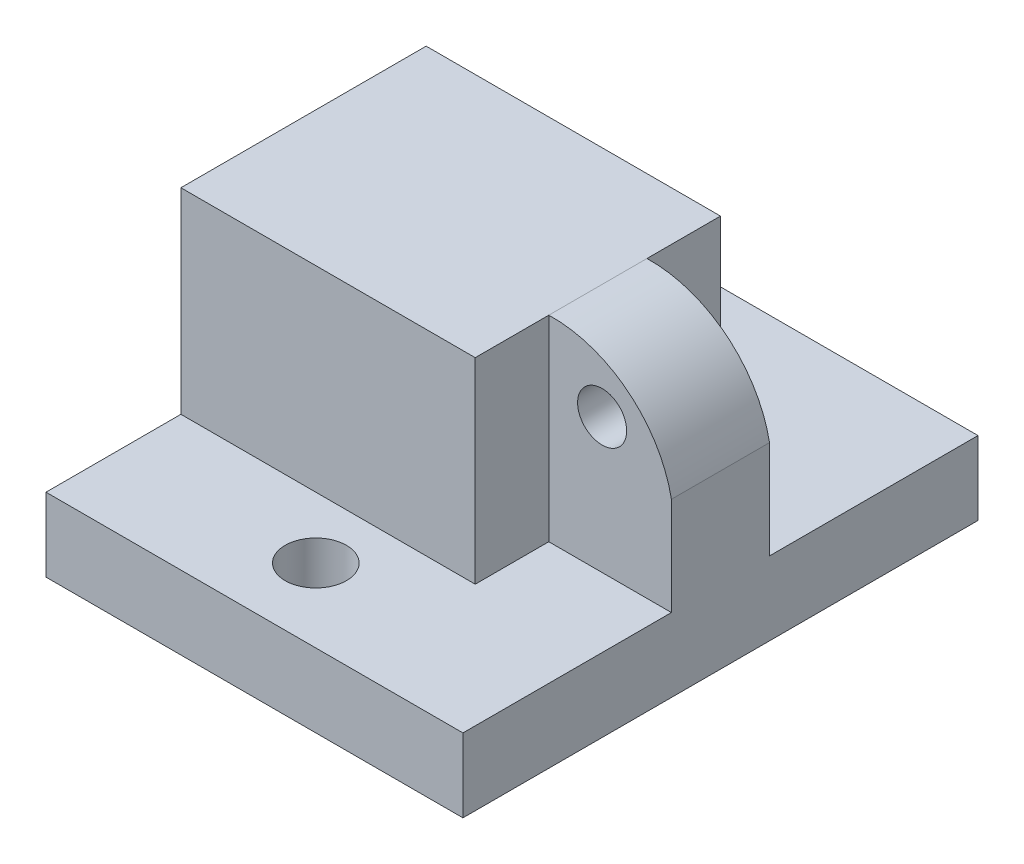
ISO-10303-21;
HEADER;
FILE_DESCRIPTION(('STEP AP214'),'2;1');
FILE_NAME('part.step','',(''),(''),'','','');
FILE_SCHEMA(('AUTOMOTIVE_DESIGN { 1 0 10303 214 1 1 1 1 }'));
ENDSEC;
DATA;
#1=APPLICATION_CONTEXT('core data for automotive mechanical design processes');
#2=APPLICATION_PROTOCOL_DEFINITION('international standard','automotive_design',2000,#1);
#3=PRODUCT_CONTEXT('',#1,'mechanical');
#4=PRODUCT('Part','Part','',(#3));
#5=PRODUCT_RELATED_PRODUCT_CATEGORY('part','',(#4));
#6=PRODUCT_DEFINITION_FORMATION('','',#4);
#7=PRODUCT_DEFINITION_CONTEXT('part definition',#1,'design');
#8=PRODUCT_DEFINITION('design','',#6,#7);
#9=PRODUCT_DEFINITION_SHAPE('','',#8);
#10=(LENGTH_UNIT() NAMED_UNIT(*) SI_UNIT(.MILLI.,.METRE.));
#11=(NAMED_UNIT(*) PLANE_ANGLE_UNIT() SI_UNIT($,.RADIAN.));
#12=(NAMED_UNIT(*) SI_UNIT($,.STERADIAN.) SOLID_ANGLE_UNIT());
#13=UNCERTAINTY_MEASURE_WITH_UNIT(LENGTH_MEASURE(1.E-05),#10,'distance_accuracy_value','');
#14=(GEOMETRIC_REPRESENTATION_CONTEXT(3) GLOBAL_UNCERTAINTY_ASSIGNED_CONTEXT((#13)) GLOBAL_UNIT_ASSIGNED_CONTEXT((#10,
#11,#12)) REPRESENTATION_CONTEXT('',''));
#15=CARTESIAN_POINT('',(0.,0.,0.));
#16=DIRECTION('',(0.,0.,1.));
#17=DIRECTION('',(1.,0.,0.));
#18=AXIS2_PLACEMENT_3D('',#15,#16,#17);
#19=CARTESIAN_POINT('',(12.,11.,-15.5));
#20=DIRECTION('',(-1.,0.,0.));
#21=DIRECTION('',(0.,0.,1.));
#22=AXIS2_PLACEMENT_3D('',#19,#20,#21);
#23=PLANE('',#22);
#24=DIRECTION('',(0.,-1.,0.));
#25=VECTOR('',#24,1.);
#26=CARTESIAN_POINT('',(12.,7.,-8.5));
#27=LINE('',#26,#25);
#28=CARTESIAN_POINT('',(12.,11.,-8.5));
#29=VERTEX_POINT('',#28);
#30=CARTESIAN_POINT('',(12.,3.,-8.5));
#31=VERTEX_POINT('',#30);
#32=EDGE_CURVE('E65',#29,#31,#27,.T.);
#33=ORIENTED_EDGE('',*,*,#32,.F.);
#34=DIRECTION('',(0.,0.,-1.));
#35=VECTOR('',#34,1.);
#36=CARTESIAN_POINT('',(12.,11.,-15.5));
#37=LINE('',#36,#35);
#38=CARTESIAN_POINT('',(12.,11.,-5.5));
#39=VERTEX_POINT('',#38);
#40=EDGE_CURVE('E193',#39,#29,#37,.T.);
#41=ORIENTED_EDGE('',*,*,#40,.F.);
#42=DIRECTION('',(0.,-1.,0.));
#43=VECTOR('',#42,1.);
#44=CARTESIAN_POINT('',(12.,11.,-5.5));
#45=LINE('',#44,#43);
#46=CARTESIAN_POINT('',(12.,3.,-5.5));
#47=VERTEX_POINT('',#46);
#48=EDGE_CURVE('E217',#39,#47,#45,.T.);
#49=ORIENTED_EDGE('',*,*,#48,.T.);
#50=DIRECTION('',(0.,0.,-1.));
#51=VECTOR('',#50,1.);
#52=CARTESIAN_POINT('',(12.,3.,-15.5));
#53=LINE('',#52,#51);
#54=EDGE_CURVE('E204',#47,#31,#53,.T.);
#55=ORIENTED_EDGE('',*,*,#54,.T.);
#56=EDGE_LOOP('',(#33,#41,#49,#55));
#57=FACE_BOUND('',#56,.T.);
#58=ADVANCED_FACE('F39',(#57),#23,.F.);
#59=CARTESIAN_POINT('',(0.,3.,0.));
#60=DIRECTION('',(0.,-1.,0.));
#61=DIRECTION('',(0.,0.,-1.));
#62=AXIS2_PLACEMENT_3D('',#59,#60,#61);
#63=PLANE('',#62);
#64=CARTESIAN_POINT('',(8.,3.,-18.));
#65=DIRECTION('',(0.,1.,0.));
#66=DIRECTION('',(0.,0.,1.));
#67=AXIS2_PLACEMENT_3D('',#64,#65,#66);
#68=CIRCLE('',#67,1.25);
#69=CARTESIAN_POINT('',(8.,3.,-16.75));
#70=VERTEX_POINT('',#69);
#71=EDGE_CURVE('E229',#70,#70,#68,.T.);
#72=ORIENTED_EDGE('',*,*,#71,.F.);
#73=EDGE_LOOP('',(#72));
#74=FACE_BOUND('',#73,.T.);
#75=DIRECTION('',(-1.,0.,0.));
#76=VECTOR('',#75,1.);
#77=CARTESIAN_POINT('',(17.,3.,-12.5));
#78=LINE('',#77,#76);
#79=CARTESIAN_POINT('',(17.,3.,-12.5));
#80=VERTEX_POINT('',#79);
#81=CARTESIAN_POINT('',(12.,3.,-12.5));
#82=VERTEX_POINT('',#81);
#83=EDGE_CURVE('E171',#80,#82,#78,.T.);
#84=ORIENTED_EDGE('',*,*,#83,.F.);
#85=DIRECTION('',(0.,0.,-1.));
#86=VECTOR('',#85,1.);
#87=CARTESIAN_POINT('',(17.,3.,0.));
#88=LINE('',#87,#86);
#89=CARTESIAN_POINT('',(17.,3.,-21.));
#90=VERTEX_POINT('',#89);
#91=EDGE_CURVE('E142',#80,#90,#88,.T.);
#92=ORIENTED_EDGE('',*,*,#91,.T.);
#93=DIRECTION('',(-1.,0.,0.));
#94=VECTOR('',#93,1.);
#95=CARTESIAN_POINT('',(0.,3.,-21.));
#96=LINE('',#95,#94);
#97=CARTESIAN_POINT('',(0.,3.,-21.));
#98=VERTEX_POINT('',#97);
#99=EDGE_CURVE('E244',#90,#98,#96,.T.);
#100=ORIENTED_EDGE('',*,*,#99,.T.);
#101=DIRECTION('',(0.,0.,1.));
#102=VECTOR('',#101,1.);
#103=CARTESIAN_POINT('',(0.,3.,0.));
#104=LINE('',#103,#102);
#105=CARTESIAN_POINT('',(0.,3.,-15.5));
#106=VERTEX_POINT('',#105);
#107=EDGE_CURVE('E234',#98,#106,#104,.T.);
#108=ORIENTED_EDGE('',*,*,#107,.T.);
#109=DIRECTION('',(-1.,0.,0.));
#110=VECTOR('',#109,1.);
#111=CARTESIAN_POINT('',(0.,3.,-15.5));
#112=LINE('',#111,#110);
#113=CARTESIAN_POINT('',(12.,3.,-15.5));
#114=VERTEX_POINT('',#113);
#115=EDGE_CURVE('E189',#114,#106,#112,.T.);
#116=ORIENTED_EDGE('',*,*,#115,.F.);
#117=EDGE_CURVE('E203',#82,#114,#53,.T.);
#118=ORIENTED_EDGE('',*,*,#117,.F.);
#119=EDGE_LOOP('',(#84,#92,#100,#108,#116,#118));
#120=FACE_BOUND('',#119,.T.);
#121=ADVANCED_FACE('F304',(#74,#120),#63,.F.);
#122=CARTESIAN_POINT('',(8.,3.,-3.));
#123=DIRECTION('',(0.,1.,0.));
#124=DIRECTION('',(0.,0.,1.));
#125=AXIS2_PLACEMENT_3D('',#122,#123,#124);
#126=CIRCLE('',#125,1.25);
#127=CARTESIAN_POINT('',(8.,3.,-1.75));
#128=VERTEX_POINT('',#127);
#129=EDGE_CURVE('E225',#128,#128,#126,.T.);
#130=ORIENTED_EDGE('',*,*,#129,.F.);
#131=EDGE_LOOP('',(#130));
#132=FACE_BOUND('',#131,.T.);
#133=DIRECTION('',(1.,0.,0.));
#134=VECTOR('',#133,1.);
#135=CARTESIAN_POINT('',(17.,3.,-8.5));
#136=LINE('',#135,#134);
#137=CARTESIAN_POINT('',(17.,3.,-8.5));
#138=VERTEX_POINT('',#137);
#139=EDGE_CURVE('E155',#31,#138,#136,.T.);
#140=ORIENTED_EDGE('',*,*,#139,.F.);
#141=ORIENTED_EDGE('',*,*,#54,.F.);
#142=DIRECTION('',(1.,0.,0.));
#143=VECTOR('',#142,1.);
#144=CARTESIAN_POINT('',(0.,3.,-5.5));
#145=LINE('',#144,#143);
#146=CARTESIAN_POINT('',(0.,3.,-5.5));
#147=VERTEX_POINT('',#146);
#148=EDGE_CURVE('E144',#147,#47,#145,.T.);
#149=ORIENTED_EDGE('',*,*,#148,.F.);
#150=CARTESIAN_POINT('',(0.,3.,0.));
#151=VERTEX_POINT('',#150);
#152=EDGE_CURVE('E238',#147,#151,#104,.T.);
#153=ORIENTED_EDGE('',*,*,#152,.T.);
#154=DIRECTION('',(1.,0.,0.));
#155=VECTOR('',#154,1.);
#156=CARTESIAN_POINT('',(0.,3.,0.));
#157=LINE('',#156,#155);
#158=CARTESIAN_POINT('',(17.,3.,0.));
#159=VERTEX_POINT('',#158);
#160=EDGE_CURVE('E237',#151,#159,#157,.T.);
#161=ORIENTED_EDGE('',*,*,#160,.T.);
#162=EDGE_CURVE('E241',#159,#138,#88,.T.);
#163=ORIENTED_EDGE('',*,*,#162,.T.);
#164=EDGE_LOOP('',(#140,#141,#149,#153,#161,#163));
#165=FACE_BOUND('',#164,.T.);
#166=ADVANCED_FACE('F299',(#132,#165),#63,.F.);
#167=CARTESIAN_POINT('',(12.,11.,-12.5));
#168=VERTEX_POINT('',#167);
#169=CARTESIAN_POINT('',(12.,11.,-15.5));
#170=VERTEX_POINT('',#169);
#171=EDGE_CURVE('E192',#168,#170,#37,.T.);
#172=ORIENTED_EDGE('',*,*,#171,.F.);
#173=DIRECTION('',(0.,-1.,0.));
#174=VECTOR('',#173,1.);
#175=CARTESIAN_POINT('',(12.,7.,-12.5));
#176=LINE('',#175,#174);
#177=EDGE_CURVE('E57',#168,#82,#176,.T.);
#178=ORIENTED_EDGE('',*,*,#177,.T.);
#179=ORIENTED_EDGE('',*,*,#117,.T.);
#180=DIRECTION('',(0.,-1.,0.));
#181=VECTOR('',#180,1.);
#182=CARTESIAN_POINT('',(12.,11.,-15.5));
#183=LINE('',#182,#181);
#184=EDGE_CURVE('E213',#170,#114,#183,.T.);
#185=ORIENTED_EDGE('',*,*,#184,.F.);
#186=EDGE_LOOP('',(#172,#178,#179,#185));
#187=FACE_BOUND('',#186,.T.);
#188=ADVANCED_FACE('F323',(#187),#23,.F.);
#189=CARTESIAN_POINT('',(0.,3.,0.));
#190=DIRECTION('',(1.,0.,0.));
#191=DIRECTION('',(0.,0.,-1.));
#192=AXIS2_PLACEMENT_3D('',#189,#190,#191);
#193=PLANE('',#192);
#194=DIRECTION('',(0.,0.,1.));
#195=VECTOR('',#194,1.);
#196=CARTESIAN_POINT('',(0.,0.,0.));
#197=LINE('',#196,#195);
#198=CARTESIAN_POINT('',(0.,0.,-21.));
#199=VERTEX_POINT('',#198);
#200=CARTESIAN_POINT('',(0.,0.,0.));
#201=VERTEX_POINT('',#200);
#202=EDGE_CURVE('E248',#199,#201,#197,.T.);
#203=ORIENTED_EDGE('',*,*,#202,.T.);
#204=DIRECTION('',(0.,-1.,0.));
#205=VECTOR('',#204,1.);
#206=CARTESIAN_POINT('',(0.,3.,0.));
#207=LINE('',#206,#205);
#208=EDGE_CURVE('E11',#151,#201,#207,.T.);
#209=ORIENTED_EDGE('',*,*,#208,.F.);
#210=ORIENTED_EDGE('',*,*,#152,.F.);
#211=DIRECTION('',(0.,-1.,0.));
#212=VECTOR('',#211,1.);
#213=CARTESIAN_POINT('',(0.,11.,-5.5));
#214=LINE('',#213,#212);
#215=CARTESIAN_POINT('',(0.,11.,-5.5));
#216=VERTEX_POINT('',#215);
#217=EDGE_CURVE('E221',#216,#147,#214,.T.);
#218=ORIENTED_EDGE('',*,*,#217,.F.);
#219=DIRECTION('',(0.,0.,1.));
#220=VECTOR('',#219,1.);
#221=CARTESIAN_POINT('',(0.,11.,-15.5));
#222=LINE('',#221,#220);
#223=CARTESIAN_POINT('',(0.,11.,-15.5));
#224=VERTEX_POINT('',#223);
#225=EDGE_CURVE('E184',#224,#216,#222,.T.);
#226=ORIENTED_EDGE('',*,*,#225,.F.);
#227=DIRECTION('',(0.,-1.,0.));
#228=VECTOR('',#227,1.);
#229=CARTESIAN_POINT('',(0.,11.,-15.5));
#230=LINE('',#229,#228);
#231=EDGE_CURVE('E199',#224,#106,#230,.T.);
#232=ORIENTED_EDGE('',*,*,#231,.T.);
#233=ORIENTED_EDGE('',*,*,#107,.F.);
#234=DIRECTION('',(0.,-1.,0.));
#235=VECTOR('',#234,1.);
#236=CARTESIAN_POINT('',(0.,3.,-21.));
#237=LINE('',#236,#235);
#238=EDGE_CURVE('E247',#98,#199,#237,.T.);
#239=ORIENTED_EDGE('',*,*,#238,.T.);
#240=EDGE_LOOP('',(#203,#209,#210,#218,#226,#232,#233,#239));
#241=FACE_BOUND('',#240,.T.);
#242=ADVANCED_FACE('F41',(#241),#193,.F.);
#243=CARTESIAN_POINT('',(0.,3.,0.));
#244=DIRECTION('',(0.,0.,-1.));
#245=DIRECTION('',(-1.,0.,0.));
#246=AXIS2_PLACEMENT_3D('',#243,#244,#245);
#247=PLANE('',#246);
#248=DIRECTION('',(1.,0.,0.));
#249=VECTOR('',#248,1.);
#250=CARTESIAN_POINT('',(0.,0.,0.));
#251=LINE('',#250,#249);
#252=CARTESIAN_POINT('',(17.,0.,0.));
#253=VERTEX_POINT('',#252);
#254=EDGE_CURVE('E252',#201,#253,#251,.T.);
#255=ORIENTED_EDGE('',*,*,#254,.T.);
#256=DIRECTION('',(0.,-1.,0.));
#257=VECTOR('',#256,1.);
#258=CARTESIAN_POINT('',(17.,3.,0.));
#259=LINE('',#258,#257);
#260=EDGE_CURVE('E49',#159,#253,#259,.T.);
#261=ORIENTED_EDGE('',*,*,#260,.F.);
#262=ORIENTED_EDGE('',*,*,#160,.F.);
#263=ORIENTED_EDGE('',*,*,#208,.T.);
#264=EDGE_LOOP('',(#255,#261,#262,#263));
#265=FACE_BOUND('',#264,.T.);
#266=ADVANCED_FACE('F297',(#265),#247,.F.);
#267=CARTESIAN_POINT('',(17.,3.,0.));
#268=DIRECTION('',(-1.,0.,0.));
#269=DIRECTION('',(0.,0.,1.));
#270=AXIS2_PLACEMENT_3D('',#267,#268,#269);
#271=PLANE('',#270);
#272=DIRECTION('',(0.,0.,-1.));
#273=VECTOR('',#272,1.);
#274=CARTESIAN_POINT('',(17.,0.,0.));
#275=LINE('',#274,#273);
#276=CARTESIAN_POINT('',(17.,0.,-21.));
#277=VERTEX_POINT('',#276);
#278=EDGE_CURVE('E255',#253,#277,#275,.T.);
#279=ORIENTED_EDGE('',*,*,#278,.T.);
#280=DIRECTION('',(0.,-1.,0.));
#281=VECTOR('',#280,1.);
#282=CARTESIAN_POINT('',(17.,3.,-21.));
#283=LINE('',#282,#281);
#284=EDGE_CURVE('E264',#90,#277,#283,.T.);
#285=ORIENTED_EDGE('',*,*,#284,.F.);
#286=ORIENTED_EDGE('',*,*,#91,.F.);
#287=DIRECTION('',(0.,-1.,0.));
#288=VECTOR('',#287,1.);
#289=CARTESIAN_POINT('',(17.,7.,-12.5));
#290=LINE('',#289,#288);
#291=CARTESIAN_POINT('',(17.,7.,-12.5));
#292=VERTEX_POINT('',#291);
#293=EDGE_CURVE('E135',#292,#80,#290,.T.);
#294=ORIENTED_EDGE('',*,*,#293,.F.);
#295=DIRECTION('',(0.,0.,-1.));
#296=VECTOR('',#295,1.);
#297=CARTESIAN_POINT('',(17.,7.,-12.5));
#298=LINE('',#297,#296);
#299=CARTESIAN_POINT('',(17.,7.,-8.5));
#300=VERTEX_POINT('',#299);
#301=EDGE_CURVE('E139',#300,#292,#298,.T.);
#302=ORIENTED_EDGE('',*,*,#301,.F.);
#303=DIRECTION('',(0.,-1.,0.));
#304=VECTOR('',#303,1.);
#305=CARTESIAN_POINT('',(17.,7.,-8.5));
#306=LINE('',#305,#304);
#307=EDGE_CURVE('E154',#300,#138,#306,.T.);
#308=ORIENTED_EDGE('',*,*,#307,.T.);
#309=ORIENTED_EDGE('',*,*,#162,.F.);
#310=ORIENTED_EDGE('',*,*,#260,.T.);
#311=EDGE_LOOP('',(#279,#285,#286,#294,#302,#308,#309,#310));
#312=FACE_BOUND('',#311,.T.);
#313=ADVANCED_FACE('F137',(#312),#271,.F.);
#314=CARTESIAN_POINT('',(0.,3.,-21.));
#315=DIRECTION('',(0.,0.,1.));
#316=DIRECTION('',(1.,0.,0.));
#317=AXIS2_PLACEMENT_3D('',#314,#315,#316);
#318=PLANE('',#317);
#319=DIRECTION('',(-1.,0.,0.));
#320=VECTOR('',#319,1.);
#321=CARTESIAN_POINT('',(0.,0.,-21.));
#322=LINE('',#321,#320);
#323=EDGE_CURVE('E258',#277,#199,#322,.T.);
#324=ORIENTED_EDGE('',*,*,#323,.T.);
#325=ORIENTED_EDGE('',*,*,#238,.F.);
#326=ORIENTED_EDGE('',*,*,#99,.F.);
#327=ORIENTED_EDGE('',*,*,#284,.T.);
#328=EDGE_LOOP('',(#324,#325,#326,#327));
#329=FACE_BOUND('',#328,.T.);
#330=ADVANCED_FACE('F280',(#329),#318,.F.);
#331=CARTESIAN_POINT('',(0.,0.,0.));
#332=DIRECTION('',(0.,-1.,0.));
#333=DIRECTION('',(0.,0.,-1.));
#334=AXIS2_PLACEMENT_3D('',#331,#332,#333);
#335=PLANE('',#334);
#336=CARTESIAN_POINT('',(8.,0.,-3.));
#337=DIRECTION('',(0.,-1.,0.));
#338=DIRECTION('',(0.,0.,-1.));
#339=AXIS2_PLACEMENT_3D('',#336,#337,#338);
#340=CIRCLE('',#339,1.25);
#341=CARTESIAN_POINT('',(8.,0.,-4.25));
#342=VERTEX_POINT('',#341);
#343=EDGE_CURVE('E43',#342,#342,#340,.T.);
#344=ORIENTED_EDGE('',*,*,#343,.F.);
#345=EDGE_LOOP('',(#344));
#346=FACE_BOUND('',#345,.T.);
#347=CARTESIAN_POINT('',(8.,0.,-18.));
#348=DIRECTION('',(0.,-1.,0.));
#349=DIRECTION('',(0.,0.,-1.));
#350=AXIS2_PLACEMENT_3D('',#347,#348,#349);
#351=CIRCLE('',#350,1.25);
#352=CARTESIAN_POINT('',(8.,0.,-19.25));
#353=VERTEX_POINT('',#352);
#354=EDGE_CURVE('E233',#353,#353,#351,.T.);
#355=ORIENTED_EDGE('',*,*,#354,.F.);
#356=EDGE_LOOP('',(#355));
#357=FACE_BOUND('',#356,.T.);
#358=ORIENTED_EDGE('',*,*,#202,.F.);
#359=ORIENTED_EDGE('',*,*,#323,.F.);
#360=ORIENTED_EDGE('',*,*,#278,.F.);
#361=ORIENTED_EDGE('',*,*,#254,.F.);
#362=EDGE_LOOP('',(#358,#359,#360,#361));
#363=FACE_BOUND('',#362,.T.);
#364=ADVANCED_FACE('F277',(#346,#357,#363),#335,.T.);
#365=CARTESIAN_POINT('',(8.,-3.,-18.));
#366=DIRECTION('',(0.,1.,0.));
#367=DIRECTION('',(0.,0.,1.));
#368=AXIS2_PLACEMENT_3D('',#365,#366,#367);
#369=CYLINDRICAL_SURFACE('',#368,1.25);
#370=ORIENTED_EDGE('',*,*,#354,.T.);
#371=EDGE_LOOP('',(#370));
#372=FACE_BOUND('',#371,.T.);
#373=ORIENTED_EDGE('',*,*,#71,.T.);
#374=EDGE_LOOP('',(#373));
#375=FACE_BOUND('',#374,.T.);
#376=ADVANCED_FACE('F274',(#372,#375),#369,.F.);
#377=CARTESIAN_POINT('',(8.,-3.,-3.));
#378=DIRECTION('',(0.,1.,0.));
#379=DIRECTION('',(0.,0.,1.));
#380=AXIS2_PLACEMENT_3D('',#377,#378,#379);
#381=CYLINDRICAL_SURFACE('',#380,1.25);
#382=ORIENTED_EDGE('',*,*,#343,.T.);
#383=EDGE_LOOP('',(#382));
#384=FACE_BOUND('',#383,.T.);
#385=ORIENTED_EDGE('',*,*,#129,.T.);
#386=EDGE_LOOP('',(#385));
#387=FACE_BOUND('',#386,.T.);
#388=ADVANCED_FACE('F315',(#384,#387),#381,.F.);
#389=CARTESIAN_POINT('',(0.,11.,-5.5));
#390=DIRECTION('',(0.,0.,-1.));
#391=DIRECTION('',(-1.,0.,0.));
#392=AXIS2_PLACEMENT_3D('',#389,#390,#391);
#393=PLANE('',#392);
#394=ORIENTED_EDGE('',*,*,#148,.T.);
#395=ORIENTED_EDGE('',*,*,#48,.F.);
#396=DIRECTION('',(1.,0.,0.));
#397=VECTOR('',#396,1.);
#398=CARTESIAN_POINT('',(0.,11.,-5.5));
#399=LINE('',#398,#397);
#400=EDGE_CURVE('E188',#216,#39,#399,.T.);
#401=ORIENTED_EDGE('',*,*,#400,.F.);
#402=ORIENTED_EDGE('',*,*,#217,.T.);
#403=EDGE_LOOP('',(#394,#395,#401,#402));
#404=FACE_BOUND('',#403,.T.);
#405=ADVANCED_FACE('F318',(#404),#393,.F.);
#406=CARTESIAN_POINT('',(0.,11.,-15.5));
#407=DIRECTION('',(0.,0.,1.));
#408=DIRECTION('',(1.,0.,0.));
#409=AXIS2_PLACEMENT_3D('',#406,#407,#408);
#410=PLANE('',#409);
#411=ORIENTED_EDGE('',*,*,#115,.T.);
#412=ORIENTED_EDGE('',*,*,#231,.F.);
#413=DIRECTION('',(-1.,0.,0.));
#414=VECTOR('',#413,1.);
#415=CARTESIAN_POINT('',(0.,11.,-15.5));
#416=LINE('',#415,#414);
#417=EDGE_CURVE('E196',#170,#224,#416,.T.);
#418=ORIENTED_EDGE('',*,*,#417,.F.);
#419=ORIENTED_EDGE('',*,*,#184,.T.);
#420=EDGE_LOOP('',(#411,#412,#418,#419));
#421=FACE_BOUND('',#420,.T.);
#422=ADVANCED_FACE('F337',(#421),#410,.F.);
#423=CARTESIAN_POINT('',(0.,11.,0.));
#424=DIRECTION('',(0.,1.,0.));
#425=DIRECTION('',(0.,0.,1.));
#426=AXIS2_PLACEMENT_3D('',#423,#424,#425);
#427=PLANE('',#426);
#428=ORIENTED_EDGE('',*,*,#225,.T.);
#429=ORIENTED_EDGE('',*,*,#400,.T.);
#430=ORIENTED_EDGE('',*,*,#40,.T.);
#431=DIRECTION('',(0.,0.,-1.));
#432=VECTOR('',#431,1.);
#433=CARTESIAN_POINT('',(12.,11.,-8.5));
#434=LINE('',#433,#432);
#435=EDGE_CURVE('E163',#29,#168,#434,.T.);
#436=ORIENTED_EDGE('',*,*,#435,.T.);
#437=ORIENTED_EDGE('',*,*,#171,.T.);
#438=ORIENTED_EDGE('',*,*,#417,.T.);
#439=EDGE_LOOP('',(#428,#429,#430,#436,#437,#438));
#440=FACE_BOUND('',#439,.T.);
#441=ADVANCED_FACE('F363',(#440),#427,.T.);
#442=CARTESIAN_POINT('',(17.,7.,-12.5));
#443=DIRECTION('',(0.,0.,1.));
#444=DIRECTION('',(1.,0.,0.));
#445=AXIS2_PLACEMENT_3D('',#442,#443,#444);
#446=PLANE('',#445);
#447=CARTESIAN_POINT('',(14.1744250024409,8.5,-12.5));
#448=DIRECTION('',(0.,0.,1.));
#449=DIRECTION('',(1.,0.,0.));
#450=AXIS2_PLACEMENT_3D('',#447,#448,#449);
#451=CIRCLE('',#450,1.);
#452=CARTESIAN_POINT('',(15.1744250024409,8.5,-12.5));
#453=VERTEX_POINT('',#452);
#454=EDGE_CURVE('E159',#453,#453,#451,.T.);
#455=ORIENTED_EDGE('',*,*,#454,.T.);
#456=EDGE_LOOP('',(#455));
#457=FACE_BOUND('',#456,.T.);
#458=ORIENTED_EDGE('',*,*,#83,.T.);
#459=ORIENTED_EDGE('',*,*,#177,.F.);
#460=CARTESIAN_POINT('',(12.1431359637879,6.05391995473491,-12.5));
#461=DIRECTION('',(0.,0.,-1.));
#462=DIRECTION('',(-1.,0.,0.));
#463=AXIS2_PLACEMENT_3D('',#460,#461,#462);
#464=CIRCLE('',#463,4.94815073722487);
#465=EDGE_CURVE('E150',#168,#292,#464,.T.);
#466=ORIENTED_EDGE('',*,*,#465,.T.);
#467=ORIENTED_EDGE('',*,*,#293,.T.);
#468=EDGE_LOOP('',(#458,#459,#466,#467));
#469=FACE_BOUND('',#468,.T.);
#470=ADVANCED_FACE('F157',(#457,#469),#446,.F.);
#471=CARTESIAN_POINT('',(17.,7.,-8.5));
#472=DIRECTION('',(0.,0.,-1.));
#473=DIRECTION('',(-1.,0.,0.));
#474=AXIS2_PLACEMENT_3D('',#471,#472,#473);
#475=PLANE('',#474);
#476=CARTESIAN_POINT('',(14.1744250024409,8.5,-8.5));
#477=DIRECTION('',(0.,0.,1.));
#478=DIRECTION('',(1.,0.,0.));
#479=AXIS2_PLACEMENT_3D('',#476,#477,#478);
#480=CIRCLE('',#479,1.);
#481=CARTESIAN_POINT('',(15.1744250024409,8.5,-8.5));
#482=VERTEX_POINT('',#481);
#483=EDGE_CURVE('E166',#482,#482,#480,.T.);
#484=ORIENTED_EDGE('',*,*,#483,.F.);
#485=EDGE_LOOP('',(#484));
#486=FACE_BOUND('',#485,.T.);
#487=ORIENTED_EDGE('',*,*,#139,.T.);
#488=ORIENTED_EDGE('',*,*,#307,.F.);
#489=CARTESIAN_POINT('',(12.1431359637879,6.05391995473491,-8.5));
#490=DIRECTION('',(0.,0.,-1.));
#491=DIRECTION('',(-1.,0.,0.));
#492=AXIS2_PLACEMENT_3D('',#489,#490,#491);
#493=CIRCLE('',#492,4.94815073722487);
#494=EDGE_CURVE('E152',#29,#300,#493,.T.);
#495=ORIENTED_EDGE('',*,*,#494,.F.);
#496=ORIENTED_EDGE('',*,*,#32,.T.);
#497=EDGE_LOOP('',(#487,#488,#495,#496));
#498=FACE_BOUND('',#497,.T.);
#499=ADVANCED_FACE('F379',(#486,#498),#475,.F.);
#500=CARTESIAN_POINT('',(12.1431359637879,6.05391995473491,-8.5));
#501=DIRECTION('',(0.,0.,-1.));
#502=DIRECTION('',(-1.,0.,0.));
#503=AXIS2_PLACEMENT_3D('',#500,#501,#502);
#504=CYLINDRICAL_SURFACE('',#503,4.94815073722487);
#505=ORIENTED_EDGE('',*,*,#465,.F.);
#506=ORIENTED_EDGE('',*,*,#435,.F.);
#507=ORIENTED_EDGE('',*,*,#494,.T.);
#508=ORIENTED_EDGE('',*,*,#301,.T.);
#509=EDGE_LOOP('',(#505,#506,#507,#508));
#510=FACE_BOUND('',#509,.T.);
#511=ADVANCED_FACE('F148',(#510),#504,.T.);
#512=CARTESIAN_POINT('',(14.1744250024409,8.5,-14.5));
#513=DIRECTION('',(0.,0.,1.));
#514=DIRECTION('',(1.,0.,0.));
#515=AXIS2_PLACEMENT_3D('',#512,#513,#514);
#516=CYLINDRICAL_SURFACE('',#515,1.);
#517=ORIENTED_EDGE('',*,*,#483,.T.);
#518=EDGE_LOOP('',(#517));
#519=FACE_BOUND('',#518,.T.);
#520=ORIENTED_EDGE('',*,*,#454,.F.);
#521=EDGE_LOOP('',(#520));
#522=FACE_BOUND('',#521,.T.);
#523=ADVANCED_FACE('F394',(#519,#522),#516,.F.);
#524=CLOSED_SHELL('',(#58,#121,#166,#188,#242,#266,#313,#330,#364,#376,#388,#405,#422,#441,#470,
#499,#511,#523));
#525=MANIFOLD_SOLID_BREP('B2',#524);
#526=ADVANCED_BREP_SHAPE_REPRESENTATION('',(#18,#525),#14);
#527=SHAPE_DEFINITION_REPRESENTATION(#9,#526);
ENDSEC;
END-ISO-10303-21;
